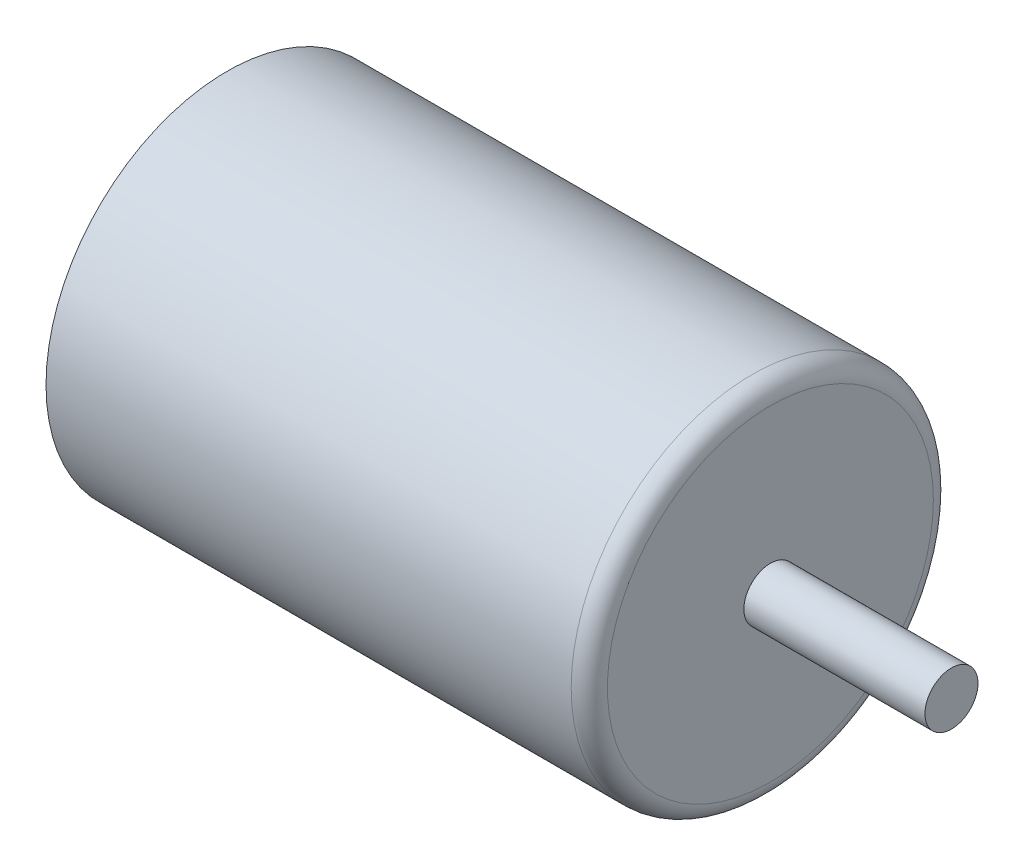
ISO-10303-21;
HEADER;
FILE_DESCRIPTION(('STEP AP214'),'2;1');
FILE_NAME('part.step','',(''),(''),'','','');
FILE_SCHEMA(('AUTOMOTIVE_DESIGN { 1 0 10303 214 1 1 1 1 }'));
ENDSEC;
DATA;
#1=APPLICATION_CONTEXT('core data for automotive mechanical design processes');
#2=APPLICATION_PROTOCOL_DEFINITION('international standard','automotive_design',2000,#1);
#3=PRODUCT_CONTEXT('',#1,'mechanical');
#4=PRODUCT('Part','Part','',(#3));
#5=PRODUCT_RELATED_PRODUCT_CATEGORY('part','',(#4));
#6=PRODUCT_DEFINITION_FORMATION('','',#4);
#7=PRODUCT_DEFINITION_CONTEXT('part definition',#1,'design');
#8=PRODUCT_DEFINITION('design','',#6,#7);
#9=PRODUCT_DEFINITION_SHAPE('','',#8);
#10=(LENGTH_UNIT() NAMED_UNIT(*) SI_UNIT(.MILLI.,.METRE.));
#11=(NAMED_UNIT(*) PLANE_ANGLE_UNIT() SI_UNIT($,.RADIAN.));
#12=(NAMED_UNIT(*) SI_UNIT($,.STERADIAN.) SOLID_ANGLE_UNIT());
#13=UNCERTAINTY_MEASURE_WITH_UNIT(LENGTH_MEASURE(1.E-05),#10,'distance_accuracy_value','');
#14=(GEOMETRIC_REPRESENTATION_CONTEXT(3) GLOBAL_UNCERTAINTY_ASSIGNED_CONTEXT((#13)) GLOBAL_UNIT_ASSIGNED_CONTEXT((#10,
#11,#12)) REPRESENTATION_CONTEXT('',''));
#15=CARTESIAN_POINT('',(0.,0.,0.));
#16=DIRECTION('',(0.,0.,1.));
#17=DIRECTION('',(1.,0.,0.));
#18=AXIS2_PLACEMENT_3D('',#15,#16,#17);
#19=CARTESIAN_POINT('',(76.2,0.,0.));
#20=DIRECTION('',(-1.,0.,0.));
#21=DIRECTION('',(0.,0.,1.));
#22=AXIS2_PLACEMENT_3D('',#19,#20,#21);
#23=CYLINDRICAL_SURFACE('',#22,25.4);
#24=CARTESIAN_POINT('',(73.66,0.,0.));
#25=DIRECTION('',(1.,0.,0.));
#26=DIRECTION('',(0.,0.,-1.));
#27=AXIS2_PLACEMENT_3D('',#24,#25,#26);
#28=CIRCLE('',#27,25.4);
#29=CARTESIAN_POINT('',(73.66,0.,25.4));
#30=VERTEX_POINT('',#29);
#31=EDGE_CURVE('E10',#30,#30,#28,.F.);
#32=CARTESIAN_POINT('',(0.,0.,0.));
#33=DIRECTION('',(1.,0.,0.));
#34=DIRECTION('',(0.,0.,-1.));
#35=AXIS2_PLACEMENT_3D('',#32,#33,#34);
#36=CIRCLE('',#35,25.4);
#37=CARTESIAN_POINT('',(0.,0.,25.4));
#38=VERTEX_POINT('',#37);
#39=EDGE_CURVE('E52',#38,#38,#36,.T.);
#40=CARTESIAN_POINT('',(73.66,0.,25.4));
#41=CARTESIAN_POINT('',(72.8927083333333,0.,25.4));
#42=CARTESIAN_POINT('',(72.1254166666667,0.,25.4));
#43=CARTESIAN_POINT('',(70.5908333333333,0.,25.4));
#44=CARTESIAN_POINT('',(69.8235416666667,0.,25.4));
#45=CARTESIAN_POINT('',(68.2889583333333,0.,25.4));
#46=CARTESIAN_POINT('',(67.5216666666667,0.,25.4));
#47=CARTESIAN_POINT('',(65.9870833333333,0.,25.4));
#48=CARTESIAN_POINT('',(65.2197916666667,0.,25.4));
#49=CARTESIAN_POINT('',(63.6852083333333,0.,25.4));
#50=CARTESIAN_POINT('',(62.9179166666667,0.,25.4));
#51=CARTESIAN_POINT('',(61.3833333333333,0.,25.4));
#52=CARTESIAN_POINT('',(60.6160416666667,0.,25.4));
#53=CARTESIAN_POINT('',(59.0814583333333,0.,25.4));
#54=CARTESIAN_POINT('',(58.3141666666667,0.,25.4));
#55=CARTESIAN_POINT('',(56.7795833333333,0.,25.4));
#56=CARTESIAN_POINT('',(56.0122916666667,0.,25.4));
#57=CARTESIAN_POINT('',(54.4777083333333,0.,25.4));
#58=CARTESIAN_POINT('',(53.7104166666667,0.,25.4));
#59=CARTESIAN_POINT('',(52.1758333333333,0.,25.4));
#60=CARTESIAN_POINT('',(51.4085416666667,0.,25.4));
#61=CARTESIAN_POINT('',(49.8739583333333,0.,25.4));
#62=CARTESIAN_POINT('',(49.1066666666667,0.,25.4));
#63=CARTESIAN_POINT('',(47.5720833333333,0.,25.4));
#64=CARTESIAN_POINT('',(46.8047916666667,0.,25.4));
#65=CARTESIAN_POINT('',(45.2702083333333,0.,25.4));
#66=CARTESIAN_POINT('',(44.5029166666667,0.,25.4));
#67=CARTESIAN_POINT('',(42.9683333333333,0.,25.4));
#68=CARTESIAN_POINT('',(42.2010416666667,0.,25.4));
#69=CARTESIAN_POINT('',(40.6664583333333,0.,25.4));
#70=CARTESIAN_POINT('',(39.8991666666667,0.,25.4));
#71=CARTESIAN_POINT('',(38.3645833333333,0.,25.4));
#72=CARTESIAN_POINT('',(37.5972916666667,0.,25.4));
#73=CARTESIAN_POINT('',(36.0627083333333,0.,25.4));
#74=CARTESIAN_POINT('',(35.2954166666667,0.,25.4));
#75=CARTESIAN_POINT('',(33.7608333333333,0.,25.4));
#76=CARTESIAN_POINT('',(32.9935416666667,0.,25.4));
#77=CARTESIAN_POINT('',(31.4589583333333,0.,25.4));
#78=CARTESIAN_POINT('',(30.6916666666667,0.,25.4));
#79=CARTESIAN_POINT('',(29.1570833333333,0.,25.4));
#80=CARTESIAN_POINT('',(28.3897916666667,0.,25.4));
#81=CARTESIAN_POINT('',(26.8552083333333,0.,25.4));
#82=CARTESIAN_POINT('',(26.0879166666667,0.,25.4));
#83=CARTESIAN_POINT('',(24.5533333333333,0.,25.4));
#84=CARTESIAN_POINT('',(23.7860416666667,0.,25.4));
#85=CARTESIAN_POINT('',(22.2514583333333,0.,25.4));
#86=CARTESIAN_POINT('',(21.4841666666667,0.,25.4));
#87=CARTESIAN_POINT('',(19.9495833333333,0.,25.4));
#88=CARTESIAN_POINT('',(19.1822916666667,0.,25.4));
#89=CARTESIAN_POINT('',(17.6477083333333,0.,25.4));
#90=CARTESIAN_POINT('',(16.8804166666667,0.,25.4));
#91=CARTESIAN_POINT('',(15.3458333333333,0.,25.4));
#92=CARTESIAN_POINT('',(14.5785416666667,0.,25.4));
#93=CARTESIAN_POINT('',(13.0439583333333,0.,25.4));
#94=CARTESIAN_POINT('',(12.2766666666667,0.,25.4));
#95=CARTESIAN_POINT('',(10.7420833333333,0.,25.4));
#96=CARTESIAN_POINT('',(9.97479166666667,0.,25.4));
#97=CARTESIAN_POINT('',(8.44020833333334,0.,25.4));
#98=CARTESIAN_POINT('',(7.67291666666667,0.,25.4));
#99=CARTESIAN_POINT('',(6.13833333333333,0.,25.4));
#100=CARTESIAN_POINT('',(5.37104166666667,0.,25.4));
#101=CARTESIAN_POINT('',(3.83645833333333,0.,25.4));
#102=CARTESIAN_POINT('',(3.06916666666666,0.,25.4));
#103=CARTESIAN_POINT('',(1.53458333333333,0.,25.4));
#104=CARTESIAN_POINT('',(0.767291666666665,0.,25.4));
#105=CARTESIAN_POINT('',(0.,0.,25.4));
#106=B_SPLINE_CURVE_WITH_KNOTS('',3,(#40,#41,#42,#43,#44,#45,#46,#47,#48,#49,#50,#51,#52,#53,
#54,#55,#56,#57,#58,#59,#60,#61,#62,#63,#64,#65,#66,#67,#68,#69,#70,#71,#72,#73,#74,#75,#76,#77,
#78,#79,#80,#81,#82,#83,#84,#85,#86,#87,#88,#89,#90,#91,#92,#93,#94,#95,#96,#97,#98,#99,#100,
#101,#102,#103,#104,#105),.UNSPECIFIED.,.F.,.F.,(4,2,2,2,2,2,2,2,2,2,2,2,2,2,2,2,2,2,2,2,2,2,2,
2,2,2,2,2,2,2,2,2,4),(0.,2.301875,4.60374999999999,6.905625,9.20749999999999,11.509375,13.81125,
16.113125,18.415,20.716875,23.01875,25.320625,27.6225,29.924375,32.22625,34.528125,36.83,
39.131875,41.43375,43.735625,46.0375,48.339375,50.64125,52.943125,55.245,57.546875,59.84875,
62.150625,64.4525,66.754375,69.05625,71.358125,73.66),.UNSPECIFIED.);
#107=EDGE_CURVE('BSEAM39',#30,#38,#106,.T.);
#108=ORIENTED_EDGE('',*,*,#31,.T.);
#109=ORIENTED_EDGE('',*,*,#39,.T.);
#110=ORIENTED_EDGE('',*,*,#107,.T.);
#111=ORIENTED_EDGE('',*,*,#107,.F.);
#112=EDGE_LOOP('',(#108,#110,#109,#111));
#113=FACE_BOUND('',#112,.T.);
#114=ADVANCED_FACE('F39',(#113),#23,.T.);
#115=CARTESIAN_POINT('',(76.2,0.,0.));
#116=DIRECTION('',(1.,0.,0.));
#117=DIRECTION('',(0.,0.,-1.));
#118=AXIS2_PLACEMENT_3D('',#115,#116,#117);
#119=PLANE('',#118);
#120=CARTESIAN_POINT('',(76.2,0.,0.));
#121=DIRECTION('',(1.,0.,0.));
#122=DIRECTION('',(0.,0.,-1.));
#123=AXIS2_PLACEMENT_3D('',#120,#121,#122);
#124=CIRCLE('',#123,22.86);
#125=CARTESIAN_POINT('',(76.2,0.,-22.86));
#126=VERTEX_POINT('',#125);
#127=EDGE_CURVE('E47',#126,#126,#124,.T.);
#128=ORIENTED_EDGE('',*,*,#127,.T.);
#129=EDGE_LOOP('',(#128));
#130=FACE_BOUND('',#129,.T.);
#131=CARTESIAN_POINT('',(76.2,0.,0.));
#132=DIRECTION('',(1.,0.,0.));
#133=DIRECTION('',(0.,0.,-1.));
#134=AXIS2_PLACEMENT_3D('',#131,#132,#133);
#135=CIRCLE('',#134,3.72051644253936);
#136=CARTESIAN_POINT('',(76.2,0.,-3.72051644253936));
#137=VERTEX_POINT('',#136);
#138=EDGE_CURVE('E60',#137,#137,#135,.T.);
#139=ORIENTED_EDGE('',*,*,#138,.F.);
#140=EDGE_LOOP('',(#139));
#141=FACE_BOUND('',#140,.T.);
#142=ADVANCED_FACE('F77',(#130,#141),#119,.T.);
#143=CARTESIAN_POINT('',(0.,0.,0.));
#144=DIRECTION('',(1.,0.,0.));
#145=DIRECTION('',(0.,0.,-1.));
#146=AXIS2_PLACEMENT_3D('',#143,#144,#145);
#147=PLANE('',#146);
#148=ORIENTED_EDGE('',*,*,#39,.F.);
#149=EDGE_LOOP('',(#148));
#150=FACE_BOUND('',#149,.T.);
#151=ADVANCED_FACE('F73',(#150),#147,.F.);
#152=CARTESIAN_POINT('',(101.6,0.,0.));
#153=DIRECTION('',(-1.,0.,0.));
#154=DIRECTION('',(0.,0.,1.));
#155=AXIS2_PLACEMENT_3D('',#152,#153,#154);
#156=CYLINDRICAL_SURFACE('',#155,3.72051644253936);
#157=CARTESIAN_POINT('',(101.6,0.,0.));
#158=DIRECTION('',(1.,0.,0.));
#159=DIRECTION('',(0.,0.,-1.));
#160=AXIS2_PLACEMENT_3D('',#157,#158,#159);
#161=CIRCLE('',#160,3.72051644253936);
#162=CARTESIAN_POINT('',(101.6,0.,-3.72051644253936));
#163=VERTEX_POINT('',#162);
#164=EDGE_CURVE('E57',#163,#163,#161,.T.);
#165=ORIENTED_EDGE('',*,*,#164,.F.);
#166=EDGE_LOOP('',(#165));
#167=FACE_BOUND('',#166,.T.);
#168=ORIENTED_EDGE('',*,*,#138,.T.);
#169=EDGE_LOOP('',(#168));
#170=FACE_BOUND('',#169,.T.);
#171=ADVANCED_FACE('F70',(#167,#170),#156,.T.);
#172=CARTESIAN_POINT('',(101.6,0.,0.));
#173=DIRECTION('',(1.,0.,0.));
#174=DIRECTION('',(0.,0.,-1.));
#175=AXIS2_PLACEMENT_3D('',#172,#173,#174);
#176=PLANE('',#175);
#177=ORIENTED_EDGE('',*,*,#164,.T.);
#178=EDGE_LOOP('',(#177));
#179=FACE_BOUND('',#178,.T.);
#180=ADVANCED_FACE('F68',(#179),#176,.T.);
#181=CARTESIAN_POINT('',(73.66,0.,0.));
#182=DIRECTION('',(1.,0.,0.));
#183=DIRECTION('',(0.,0.,-1.));
#184=AXIS2_PLACEMENT_3D('',#181,#182,#183);
#185=TOROIDAL_SURFACE('',#184,22.86,2.54);
#186=ORIENTED_EDGE('',*,*,#31,.F.);
#187=EDGE_LOOP('',(#186));
#188=FACE_BOUND('',#187,.T.);
#189=ORIENTED_EDGE('',*,*,#127,.F.);
#190=EDGE_LOOP('',(#189));
#191=FACE_BOUND('',#190,.T.);
#192=ADVANCED_FACE('F41',(#188,#191),#185,.T.);
#193=CLOSED_SHELL('',(#114,#142,#151,#171,#180,#192));
#194=MANIFOLD_SOLID_BREP('B2',#193);
#195=ADVANCED_BREP_SHAPE_REPRESENTATION('',(#18,#194),#14);
#196=SHAPE_DEFINITION_REPRESENTATION(#9,#195);
ENDSEC;
END-ISO-10303-21;
